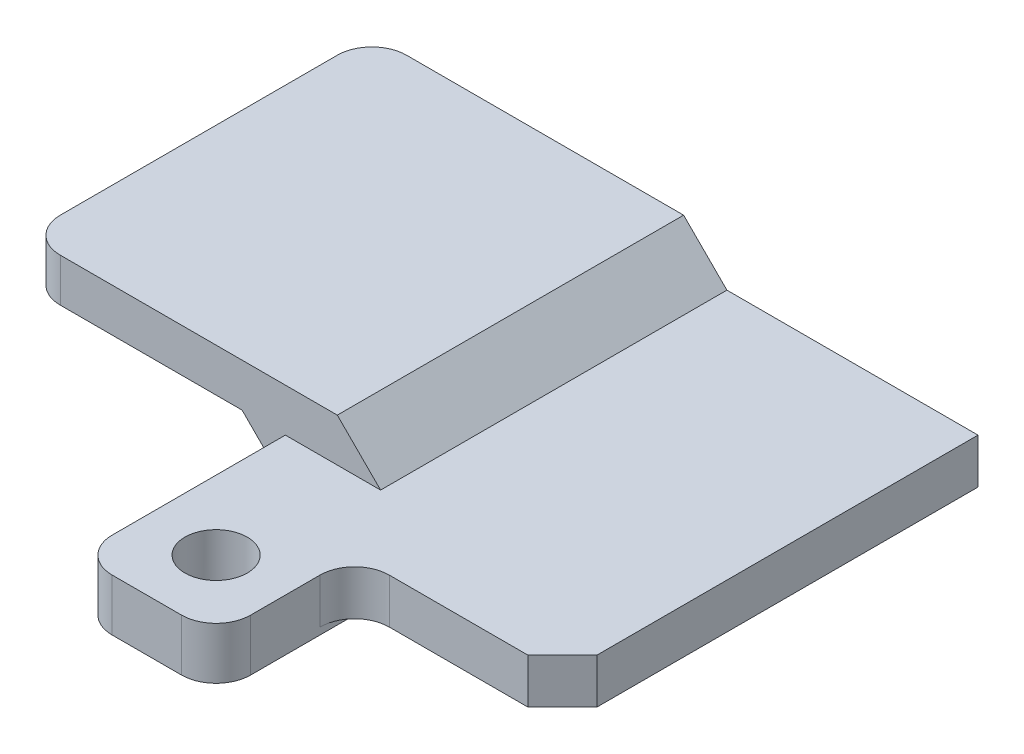
ISO-10303-21;
HEADER;
FILE_DESCRIPTION(('STEP AP214'),'2;1');
FILE_NAME('part.step','',(''),(''),'','','');
FILE_SCHEMA(('AUTOMOTIVE_DESIGN { 1 0 10303 214 1 1 1 1 }'));
ENDSEC;
DATA;
#1=APPLICATION_CONTEXT('core data for automotive mechanical design processes');
#2=APPLICATION_PROTOCOL_DEFINITION('international standard','automotive_design',2000,#1);
#3=PRODUCT_CONTEXT('',#1,'mechanical');
#4=PRODUCT('Part','Part','',(#3));
#5=PRODUCT_RELATED_PRODUCT_CATEGORY('part','',(#4));
#6=PRODUCT_DEFINITION_FORMATION('','',#4);
#7=PRODUCT_DEFINITION_CONTEXT('part definition',#1,'design');
#8=PRODUCT_DEFINITION('design','',#6,#7);
#9=PRODUCT_DEFINITION_SHAPE('','',#8);
#10=(LENGTH_UNIT() NAMED_UNIT(*) SI_UNIT(.MILLI.,.METRE.));
#11=(NAMED_UNIT(*) PLANE_ANGLE_UNIT() SI_UNIT($,.RADIAN.));
#12=(NAMED_UNIT(*) SI_UNIT($,.STERADIAN.) SOLID_ANGLE_UNIT());
#13=UNCERTAINTY_MEASURE_WITH_UNIT(LENGTH_MEASURE(1.E-05),#10,'distance_accuracy_value','');
#14=(GEOMETRIC_REPRESENTATION_CONTEXT(3) GLOBAL_UNCERTAINTY_ASSIGNED_CONTEXT((#13)) GLOBAL_UNIT_ASSIGNED_CONTEXT((#10,
#11,#12)) REPRESENTATION_CONTEXT('',''));
#15=CARTESIAN_POINT('',(0.,0.,0.));
#16=DIRECTION('',(0.,0.,1.));
#17=DIRECTION('',(1.,0.,0.));
#18=AXIS2_PLACEMENT_3D('',#15,#16,#17);
#19=CARTESIAN_POINT('',(0.,3.,0.));
#20=DIRECTION('',(0.,0.,-1.));
#21=DIRECTION('',(-1.,0.,0.));
#22=AXIS2_PLACEMENT_3D('',#19,#20,#21);
#23=PLANE('',#22);
#24=DIRECTION('',(-1.,0.,0.));
#25=VECTOR('',#24,1.);
#26=CARTESIAN_POINT('',(0.,0.4,0.));
#27=LINE('',#26,#25);
#28=CARTESIAN_POINT('',(18.,0.4,0.));
#29=VERTEX_POINT('',#28);
#30=CARTESIAN_POINT('',(10.,0.4,0.));
#31=VERTEX_POINT('',#30);
#32=EDGE_CURVE('E202',#29,#31,#27,.T.);
#33=ORIENTED_EDGE('',*,*,#32,.F.);
#34=DIRECTION('',(0.,1.,0.));
#35=VECTOR('',#34,1.);
#36=CARTESIAN_POINT('',(18.,3.,0.));
#37=LINE('',#36,#35);
#38=CARTESIAN_POINT('',(18.,3.,0.));
#39=VERTEX_POINT('',#38);
#40=EDGE_CURVE('E298',#29,#39,#37,.T.);
#41=ORIENTED_EDGE('',*,*,#40,.T.);
#42=DIRECTION('',(1.,0.,0.));
#43=VECTOR('',#42,1.);
#44=CARTESIAN_POINT('',(0.,3.,0.));
#45=LINE('',#44,#43);
#46=CARTESIAN_POINT('',(10.,3.,0.));
#47=VERTEX_POINT('',#46);
#48=EDGE_CURVE('E256',#47,#39,#45,.T.);
#49=ORIENTED_EDGE('',*,*,#48,.F.);
#50=DIRECTION('',(0.,1.,0.));
#51=VECTOR('',#50,1.);
#52=CARTESIAN_POINT('',(10.,3.,0.));
#53=LINE('',#52,#51);
#54=EDGE_CURVE('E273',#47,#31,#53,.F.);
#55=ORIENTED_EDGE('',*,*,#54,.T.);
#56=EDGE_LOOP('',(#33,#41,#49,#55));
#57=FACE_BOUND('',#56,.T.);
#58=ADVANCED_FACE('F35',(#57),#23,.F.);
#59=CARTESIAN_POINT('',(0.,3.,0.));
#60=DIRECTION('',(1.,0.,0.));
#61=DIRECTION('',(0.,0.,-1.));
#62=AXIS2_PLACEMENT_3D('',#59,#60,#61);
#63=PLANE('',#62);
#64=DIRECTION('',(0.,-1.,0.));
#65=VECTOR('',#64,1.);
#66=CARTESIAN_POINT('',(0.,0.4,0.));
#67=LINE('',#66,#65);
#68=CARTESIAN_POINT('',(0.,0.4,0.));
#69=VERTEX_POINT('',#68);
#70=CARTESIAN_POINT('',(0.,0.,0.));
#71=VERTEX_POINT('',#70);
#72=EDGE_CURVE('E171',#69,#71,#67,.T.);
#73=ORIENTED_EDGE('',*,*,#72,.T.);
#74=DIRECTION('',(0.,0.,1.));
#75=VECTOR('',#74,1.);
#76=CARTESIAN_POINT('',(0.,0.,0.));
#77=LINE('',#76,#75);
#78=CARTESIAN_POINT('',(0.,0.,6.));
#79=VERTEX_POINT('',#78);
#80=EDGE_CURVE('E250',#71,#79,#77,.T.);
#81=ORIENTED_EDGE('',*,*,#80,.T.);
#82=DIRECTION('',(0.,1.,0.));
#83=VECTOR('',#82,1.);
#84=CARTESIAN_POINT('',(0.,3.,6.));
#85=LINE('',#84,#83);
#86=CARTESIAN_POINT('',(0.,3.,6.));
#87=VERTEX_POINT('',#86);
#88=EDGE_CURVE('E290',#79,#87,#85,.T.);
#89=ORIENTED_EDGE('',*,*,#88,.T.);
#90=DIRECTION('',(0.,0.,1.));
#91=VECTOR('',#90,1.);
#92=CARTESIAN_POINT('',(0.,3.,0.));
#93=LINE('',#92,#91);
#94=CARTESIAN_POINT('',(0.,3.,-4.));
#95=VERTEX_POINT('',#94);
#96=EDGE_CURVE('E254',#95,#87,#93,.T.);
#97=ORIENTED_EDGE('',*,*,#96,.F.);
#98=DIRECTION('',(0.,1.,0.));
#99=VECTOR('',#98,1.);
#100=CARTESIAN_POINT('',(0.,0.499999999999984,-4.));
#101=LINE('',#100,#99);
#102=CARTESIAN_POINT('',(0.,0.499999999999984,-4.));
#103=VERTEX_POINT('',#102);
#104=EDGE_CURVE('E214',#103,#95,#101,.T.);
#105=ORIENTED_EDGE('',*,*,#104,.F.);
#106=DIRECTION('',(0.,0.,-1.));
#107=VECTOR('',#106,1.);
#108=CARTESIAN_POINT('',(0.,0.499999999999984,0.));
#109=LINE('',#108,#107);
#110=CARTESIAN_POINT('',(0.,0.499999999999984,-24.));
#111=VERTEX_POINT('',#110);
#112=EDGE_CURVE('E305',#103,#111,#109,.T.);
#113=ORIENTED_EDGE('',*,*,#112,.T.);
#114=DIRECTION('',(0.,-1.,0.));
#115=VECTOR('',#114,1.);
#116=CARTESIAN_POINT('',(0.,3.,-24.));
#117=LINE('',#116,#115);
#118=CARTESIAN_POINT('',(0.,0.4,-24.));
#119=VERTEX_POINT('',#118);
#120=EDGE_CURVE('E194',#111,#119,#117,.T.);
#121=ORIENTED_EDGE('',*,*,#120,.T.);
#122=DIRECTION('',(0.,0.,-1.));
#123=VECTOR('',#122,1.);
#124=CARTESIAN_POINT('',(0.,0.4,0.));
#125=LINE('',#124,#123);
#126=EDGE_CURVE('E187',#69,#119,#125,.T.);
#127=ORIENTED_EDGE('',*,*,#126,.F.);
#128=EDGE_LOOP('',(#73,#81,#89,#97,#105,#113,#121,#127));
#129=FACE_BOUND('',#128,.T.);
#130=ADVANCED_FACE('F192',(#129),#63,.F.);
#131=CARTESIAN_POINT('',(20.,3.,0.));
#132=DIRECTION('',(-1.,0.,0.));
#133=DIRECTION('',(0.,0.,1.));
#134=AXIS2_PLACEMENT_3D('',#131,#132,#133);
#135=PLANE('',#134);
#136=DIRECTION('',(0.,0.,1.));
#137=VECTOR('',#136,1.);
#138=CARTESIAN_POINT('',(20.,0.4,0.));
#139=LINE('',#138,#137);
#140=CARTESIAN_POINT('',(20.,0.4,-24.));
#141=VERTEX_POINT('',#140);
#142=CARTESIAN_POINT('',(20.,0.4,-2.));
#143=VERTEX_POINT('',#142);
#144=EDGE_CURVE('E50',#141,#143,#139,.T.);
#145=ORIENTED_EDGE('',*,*,#144,.F.);
#146=DIRECTION('',(0.,-1.,0.));
#147=VECTOR('',#146,1.);
#148=CARTESIAN_POINT('',(20.,3.,-24.));
#149=LINE('',#148,#147);
#150=CARTESIAN_POINT('',(20.,3.,-24.));
#151=VERTEX_POINT('',#150);
#152=EDGE_CURVE('E266',#151,#141,#149,.T.);
#153=ORIENTED_EDGE('',*,*,#152,.F.);
#154=DIRECTION('',(0.,0.,-1.));
#155=VECTOR('',#154,1.);
#156=CARTESIAN_POINT('',(20.,3.,0.));
#157=LINE('',#156,#155);
#158=CARTESIAN_POINT('',(20.,3.,-2.));
#159=VERTEX_POINT('',#158);
#160=EDGE_CURVE('E259',#159,#151,#157,.T.);
#161=ORIENTED_EDGE('',*,*,#160,.F.);
#162=DIRECTION('',(0.,-1.,0.));
#163=VECTOR('',#162,1.);
#164=CARTESIAN_POINT('',(20.,3.,-2.));
#165=LINE('',#164,#163);
#166=EDGE_CURVE('E295',#159,#143,#165,.T.);
#167=ORIENTED_EDGE('',*,*,#166,.T.);
#168=EDGE_LOOP('',(#145,#153,#161,#167));
#169=FACE_BOUND('',#168,.T.);
#170=ADVANCED_FACE('F370',(#169),#135,.F.);
#171=CARTESIAN_POINT('',(0.,3.,-24.));
#172=DIRECTION('',(0.,0.,1.));
#173=DIRECTION('',(1.,0.,0.));
#174=AXIS2_PLACEMENT_3D('',#171,#172,#173);
#175=PLANE('',#174);
#176=DIRECTION('',(1.,0.,0.));
#177=VECTOR('',#176,1.);
#178=CARTESIAN_POINT('',(0.,0.4,-24.));
#179=LINE('',#178,#177);
#180=EDGE_CURVE('E195',#119,#141,#179,.T.);
#181=ORIENTED_EDGE('',*,*,#180,.F.);
#182=ORIENTED_EDGE('',*,*,#120,.F.);
#183=DIRECTION('',(-0.707106781186544,0.707106781186551,0.));
#184=VECTOR('',#183,1.);
#185=CARTESIAN_POINT('',(-1.25000000000001,1.75000000000001,-24.));
#186=LINE('',#185,#184);
#187=CARTESIAN_POINT('',(-2.49999999999999,3.,-24.));
#188=VERTEX_POINT('',#187);
#189=EDGE_CURVE('E310',#111,#188,#186,.T.);
#190=ORIENTED_EDGE('',*,*,#189,.T.);
#191=DIRECTION('',(-1.,0.,0.));
#192=VECTOR('',#191,1.);
#193=CARTESIAN_POINT('',(3.,3.,-24.));
#194=LINE('',#193,#192);
#195=CARTESIAN_POINT('',(-13.,3.,-24.));
#196=VERTEX_POINT('',#195);
#197=EDGE_CURVE('E224',#188,#196,#194,.T.);
#198=ORIENTED_EDGE('',*,*,#197,.T.);
#199=DIRECTION('',(0.,-1.,0.));
#200=VECTOR('',#199,1.);
#201=CARTESIAN_POINT('',(-13.,3.,-24.));
#202=LINE('',#201,#200);
#203=CARTESIAN_POINT('',(-13.,5.5,-24.));
#204=VERTEX_POINT('',#203);
#205=EDGE_CURVE('E11',#196,#204,#202,.F.);
#206=ORIENTED_EDGE('',*,*,#205,.T.);
#207=DIRECTION('',(-1.,0.,0.));
#208=VECTOR('',#207,1.);
#209=CARTESIAN_POINT('',(3.,5.5,-24.));
#210=LINE('',#209,#208);
#211=CARTESIAN_POINT('',(3.,5.5,-24.));
#212=VERTEX_POINT('',#211);
#213=EDGE_CURVE('E227',#212,#204,#210,.T.);
#214=ORIENTED_EDGE('',*,*,#213,.F.);
#215=DIRECTION('',(-0.707106781186549,0.707106781186546,0.));
#216=VECTOR('',#215,1.);
#217=CARTESIAN_POINT('',(2.74999999999999,5.75,-24.));
#218=LINE('',#217,#216);
#219=CARTESIAN_POINT('',(5.50000000000001,3.,-24.));
#220=VERTEX_POINT('',#219);
#221=EDGE_CURVE('E312',#212,#220,#218,.F.);
#222=ORIENTED_EDGE('',*,*,#221,.T.);
#223=DIRECTION('',(-1.,0.,0.));
#224=VECTOR('',#223,1.);
#225=CARTESIAN_POINT('',(0.,3.,-24.));
#226=LINE('',#225,#224);
#227=EDGE_CURVE('E261',#151,#220,#226,.T.);
#228=ORIENTED_EDGE('',*,*,#227,.F.);
#229=ORIENTED_EDGE('',*,*,#152,.T.);
#230=EDGE_LOOP('',(#181,#182,#190,#198,#206,#214,#222,#228,#229));
#231=FACE_BOUND('',#230,.T.);
#232=ADVANCED_FACE('F351',(#231),#175,.F.);
#233=CARTESIAN_POINT('',(0.,0.,0.));
#234=DIRECTION('',(0.,-1.,0.));
#235=DIRECTION('',(0.,0.,-1.));
#236=AXIS2_PLACEMENT_3D('',#233,#234,#235);
#237=PLANE('',#236);
#238=CARTESIAN_POINT('',(4.,0.,4.));
#239=DIRECTION('',(0.,-1.,0.));
#240=DIRECTION('',(0.,0.,-1.));
#241=AXIS2_PLACEMENT_3D('',#238,#239,#240);
#242=CIRCLE('',#241,1.8);
#243=CARTESIAN_POINT('',(4.,0.,2.2));
#244=VERTEX_POINT('',#243);
#245=EDGE_CURVE('E240',#244,#244,#242,.F.);
#246=ORIENTED_EDGE('',*,*,#245,.T.);
#247=EDGE_LOOP('',(#246));
#248=FACE_BOUND('',#247,.T.);
#249=ORIENTED_EDGE('',*,*,#80,.F.);
#250=DIRECTION('',(1.,0.,0.));
#251=VECTOR('',#250,1.);
#252=CARTESIAN_POINT('',(0.,0.,0.));
#253=LINE('',#252,#251);
#254=CARTESIAN_POINT('',(8.,0.,0.));
#255=VERTEX_POINT('',#254);
#256=EDGE_CURVE('E178',#71,#255,#253,.T.);
#257=ORIENTED_EDGE('',*,*,#256,.T.);
#258=DIRECTION('',(0.,0.,-1.));
#259=VECTOR('',#258,1.);
#260=CARTESIAN_POINT('',(8.,0.,8.));
#261=LINE('',#260,#259);
#262=CARTESIAN_POINT('',(8.,0.,6.));
#263=VERTEX_POINT('',#262);
#264=EDGE_CURVE('E233',#263,#255,#261,.T.);
#265=ORIENTED_EDGE('',*,*,#264,.F.);
#266=CARTESIAN_POINT('',(6.,0.,6.));
#267=DIRECTION('',(0.,-1.,0.));
#268=DIRECTION('',(0.,0.,-1.));
#269=AXIS2_PLACEMENT_3D('',#266,#267,#268);
#270=CIRCLE('',#269,2.);
#271=CARTESIAN_POINT('',(6.,0.,8.));
#272=VERTEX_POINT('',#271);
#273=EDGE_CURVE('E288',#263,#272,#270,.T.);
#274=ORIENTED_EDGE('',*,*,#273,.T.);
#275=DIRECTION('',(1.,0.,0.));
#276=VECTOR('',#275,1.);
#277=CARTESIAN_POINT('',(0.,0.,8.));
#278=LINE('',#277,#276);
#279=CARTESIAN_POINT('',(2.,0.,8.));
#280=VERTEX_POINT('',#279);
#281=EDGE_CURVE('E247',#280,#272,#278,.T.);
#282=ORIENTED_EDGE('',*,*,#281,.F.);
#283=CARTESIAN_POINT('',(2.,0.,6.));
#284=DIRECTION('',(0.,-1.,0.));
#285=DIRECTION('',(0.,0.,-1.));
#286=AXIS2_PLACEMENT_3D('',#283,#284,#285);
#287=CIRCLE('',#286,2.);
#288=EDGE_CURVE('E285',#280,#79,#287,.T.);
#289=ORIENTED_EDGE('',*,*,#288,.T.);
#290=EDGE_LOOP('',(#249,#257,#265,#274,#282,#289));
#291=FACE_BOUND('',#290,.T.);
#292=ADVANCED_FACE('F390',(#248,#291),#237,.T.);
#293=CARTESIAN_POINT('',(10.,-11.3137084989848,2.));
#294=DIRECTION('',(0.,1.,0.));
#295=DIRECTION('',(0.,0.,1.));
#296=AXIS2_PLACEMENT_3D('',#293,#294,#295);
#297=CYLINDRICAL_SURFACE('',#296,2.);
#298=CARTESIAN_POINT('',(10.,0.4,2.));
#299=DIRECTION('',(0.,-1.,0.));
#300=DIRECTION('',(0.,0.,-1.));
#301=AXIS2_PLACEMENT_3D('',#298,#299,#300);
#302=CIRCLE('',#301,2.);
#303=CARTESIAN_POINT('',(8.,0.4,2.));
#304=VERTEX_POINT('',#303);
#305=EDGE_CURVE('E204',#31,#304,#302,.F.);
#306=ORIENTED_EDGE('',*,*,#305,.F.);
#307=ORIENTED_EDGE('',*,*,#54,.F.);
#308=CARTESIAN_POINT('',(10.,3.,2.));
#309=DIRECTION('',(0.,-1.,0.));
#310=DIRECTION('',(0.,0.,-1.));
#311=AXIS2_PLACEMENT_3D('',#308,#309,#310);
#312=CIRCLE('',#311,2.);
#313=CARTESIAN_POINT('',(8.,3.,2.));
#314=VERTEX_POINT('',#313);
#315=EDGE_CURVE('E293',#314,#47,#312,.T.);
#316=ORIENTED_EDGE('',*,*,#315,.F.);
#317=DIRECTION('',(0.,1.,0.));
#318=VECTOR('',#317,1.);
#319=CARTESIAN_POINT('',(8.,-11.3137084989848,2.));
#320=LINE('',#319,#318);
#321=EDGE_CURVE('E271',#304,#314,#320,.T.);
#322=ORIENTED_EDGE('',*,*,#321,.F.);
#323=EDGE_LOOP('',(#306,#307,#316,#322));
#324=FACE_BOUND('',#323,.T.);
#325=ADVANCED_FACE('F383',(#324),#297,.F.);
#326=CARTESIAN_POINT('',(20.,3.,-2.));
#327=DIRECTION('',(-0.707106781186547,0.,-0.707106781186548));
#328=DIRECTION('',(0.,-1.,0.));
#329=AXIS2_PLACEMENT_3D('',#326,#327,#328);
#330=PLANE('',#329);
#331=ORIENTED_EDGE('',*,*,#40,.F.);
#332=DIRECTION('',(-0.707106781186548,0.,0.707106781186547));
#333=VECTOR('',#332,1.);
#334=CARTESIAN_POINT('',(8.99999999999998,0.4,9.));
#335=LINE('',#334,#333);
#336=EDGE_CURVE('E200',#143,#29,#335,.T.);
#337=ORIENTED_EDGE('',*,*,#336,.F.);
#338=ORIENTED_EDGE('',*,*,#166,.F.);
#339=DIRECTION('',(-0.707106781186548,0.,0.707106781186547));
#340=VECTOR('',#339,1.);
#341=CARTESIAN_POINT('',(20.,3.,-2.));
#342=LINE('',#341,#340);
#343=EDGE_CURVE('E300',#39,#159,#342,.F.);
#344=ORIENTED_EDGE('',*,*,#343,.F.);
#345=EDGE_LOOP('',(#331,#337,#338,#344));
#346=FACE_BOUND('',#345,.T.);
#347=ADVANCED_FACE('F375',(#346),#330,.F.);
#348=CARTESIAN_POINT('',(-15.,5.5,-24.));
#349=DIRECTION('',(1.,0.,0.));
#350=DIRECTION('',(0.,0.,-1.));
#351=AXIS2_PLACEMENT_3D('',#348,#349,#350);
#352=PLANE('',#351);
#353=DIRECTION('',(0.,0.,1.));
#354=VECTOR('',#353,1.);
#355=CARTESIAN_POINT('',(-15.,3.,-24.));
#356=LINE('',#355,#354);
#357=CARTESIAN_POINT('',(-15.,3.,-22.));
#358=VERTEX_POINT('',#357);
#359=CARTESIAN_POINT('',(-15.,3.,-6.));
#360=VERTEX_POINT('',#359);
#361=EDGE_CURVE('E228',#358,#360,#356,.T.);
#362=ORIENTED_EDGE('',*,*,#361,.T.);
#363=DIRECTION('',(0.,-1.,0.));
#364=VECTOR('',#363,1.);
#365=CARTESIAN_POINT('',(-15.,5.5,-6.));
#366=LINE('',#365,#364);
#367=CARTESIAN_POINT('',(-15.,5.5,-6.));
#368=VERTEX_POINT('',#367);
#369=EDGE_CURVE('E324',#360,#368,#366,.F.);
#370=ORIENTED_EDGE('',*,*,#369,.T.);
#371=DIRECTION('',(0.,0.,1.));
#372=VECTOR('',#371,1.);
#373=CARTESIAN_POINT('',(-15.,5.5,-24.));
#374=LINE('',#373,#372);
#375=CARTESIAN_POINT('',(-15.,5.5,-22.));
#376=VERTEX_POINT('',#375);
#377=EDGE_CURVE('E230',#376,#368,#374,.T.);
#378=ORIENTED_EDGE('',*,*,#377,.F.);
#379=DIRECTION('',(0.,-1.,0.));
#380=VECTOR('',#379,1.);
#381=CARTESIAN_POINT('',(-15.,5.5,-22.));
#382=LINE('',#381,#380);
#383=EDGE_CURVE('E321',#376,#358,#382,.T.);
#384=ORIENTED_EDGE('',*,*,#383,.T.);
#385=EDGE_LOOP('',(#362,#370,#378,#384));
#386=FACE_BOUND('',#385,.T.);
#387=ADVANCED_FACE('F345',(#386),#352,.F.);
#388=CARTESIAN_POINT('',(0.,5.5,0.));
#389=DIRECTION('',(0.,-1.,0.));
#390=DIRECTION('',(0.,0.,-1.));
#391=AXIS2_PLACEMENT_3D('',#388,#389,#390);
#392=PLANE('',#391);
#393=ORIENTED_EDGE('',*,*,#377,.T.);
#394=CARTESIAN_POINT('',(-13.,5.5,-6.));
#395=DIRECTION('',(0.,-1.,0.));
#396=DIRECTION('',(0.,0.,-1.));
#397=AXIS2_PLACEMENT_3D('',#394,#395,#396);
#398=CIRCLE('',#397,2.);
#399=CARTESIAN_POINT('',(-13.,5.5,-4.));
#400=VERTEX_POINT('',#399);
#401=EDGE_CURVE('E43',#368,#400,#398,.F.);
#402=ORIENTED_EDGE('',*,*,#401,.T.);
#403=DIRECTION('',(-1.,0.,0.));
#404=VECTOR('',#403,1.);
#405=CARTESIAN_POINT('',(3.,5.5,-4.));
#406=LINE('',#405,#404);
#407=CARTESIAN_POINT('',(3.,5.5,-4.));
#408=VERTEX_POINT('',#407);
#409=EDGE_CURVE('E221',#408,#400,#406,.T.);
#410=ORIENTED_EDGE('',*,*,#409,.F.);
#411=DIRECTION('',(0.,0.,-1.));
#412=VECTOR('',#411,1.);
#413=CARTESIAN_POINT('',(3.,5.5,-24.));
#414=LINE('',#413,#412);
#415=EDGE_CURVE('E225',#408,#212,#414,.T.);
#416=ORIENTED_EDGE('',*,*,#415,.T.);
#417=ORIENTED_EDGE('',*,*,#213,.T.);
#418=CARTESIAN_POINT('',(-13.,5.5,-22.));
#419=DIRECTION('',(0.,-1.,0.));
#420=DIRECTION('',(0.,0.,-1.));
#421=AXIS2_PLACEMENT_3D('',#418,#419,#420);
#422=CIRCLE('',#421,2.);
#423=EDGE_CURVE('E326',#204,#376,#422,.F.);
#424=ORIENTED_EDGE('',*,*,#423,.T.);
#425=EDGE_LOOP('',(#393,#402,#410,#416,#417,#424));
#426=FACE_BOUND('',#425,.T.);
#427=ADVANCED_FACE('F330',(#426),#392,.F.);
#428=CARTESIAN_POINT('',(0.,3.,0.));
#429=DIRECTION('',(0.,-1.,0.));
#430=DIRECTION('',(0.,0.,-1.));
#431=AXIS2_PLACEMENT_3D('',#428,#429,#430);
#432=PLANE('',#431);
#433=DIRECTION('',(1.,0.,0.));
#434=VECTOR('',#433,1.);
#435=CARTESIAN_POINT('',(-15.,3.,-4.));
#436=LINE('',#435,#434);
#437=CARTESIAN_POINT('',(-13.,3.,-4.));
#438=VERTEX_POINT('',#437);
#439=CARTESIAN_POINT('',(-2.49999999999999,3.,-4.));
#440=VERTEX_POINT('',#439);
#441=EDGE_CURVE('E208',#438,#440,#436,.T.);
#442=ORIENTED_EDGE('',*,*,#441,.F.);
#443=CARTESIAN_POINT('',(-13.,3.,-6.));
#444=DIRECTION('',(0.,-1.,0.));
#445=DIRECTION('',(0.,0.,-1.));
#446=AXIS2_PLACEMENT_3D('',#443,#444,#445);
#447=CIRCLE('',#446,2.);
#448=EDGE_CURVE('E319',#438,#360,#447,.T.);
#449=ORIENTED_EDGE('',*,*,#448,.T.);
#450=ORIENTED_EDGE('',*,*,#361,.F.);
#451=CARTESIAN_POINT('',(-13.,3.,-22.));
#452=DIRECTION('',(0.,-1.,0.));
#453=DIRECTION('',(0.,0.,-1.));
#454=AXIS2_PLACEMENT_3D('',#451,#452,#453);
#455=CIRCLE('',#454,2.);
#456=EDGE_CURVE('E317',#358,#196,#455,.T.);
#457=ORIENTED_EDGE('',*,*,#456,.T.);
#458=ORIENTED_EDGE('',*,*,#197,.F.);
#459=DIRECTION('',(0.,0.,1.));
#460=VECTOR('',#459,1.);
#461=CARTESIAN_POINT('',(-2.49999999999999,3.,0.));
#462=LINE('',#461,#460);
#463=EDGE_CURVE('E302',#188,#440,#462,.T.);
#464=ORIENTED_EDGE('',*,*,#463,.T.);
#465=EDGE_LOOP('',(#442,#449,#450,#457,#458,#464));
#466=FACE_BOUND('',#465,.T.);
#467=ADVANCED_FACE('F343',(#466),#432,.T.);
#468=CARTESIAN_POINT('',(-2.49999999999999,3.,0.));
#469=DIRECTION('',(0.707106781186551,0.707106781186544,0.));
#470=DIRECTION('',(0.,0.,1.));
#471=AXIS2_PLACEMENT_3D('',#468,#469,#470);
#472=PLANE('',#471);
#473=DIRECTION('',(0.707106781186544,-0.707106781186551,0.));
#474=VECTOR('',#473,1.);
#475=CARTESIAN_POINT('',(-2.49999999999999,3.,-4.));
#476=LINE('',#475,#474);
#477=EDGE_CURVE('E211',#440,#103,#476,.T.);
#478=ORIENTED_EDGE('',*,*,#477,.F.);
#479=ORIENTED_EDGE('',*,*,#463,.F.);
#480=ORIENTED_EDGE('',*,*,#189,.F.);
#481=ORIENTED_EDGE('',*,*,#112,.F.);
#482=EDGE_LOOP('',(#478,#479,#480,#481));
#483=FACE_BOUND('',#482,.T.);
#484=ADVANCED_FACE('F356',(#483),#472,.F.);
#485=CARTESIAN_POINT('',(3.,5.5,-24.));
#486=DIRECTION('',(0.707106781186546,0.707106781186549,0.));
#487=DIRECTION('',(0.,0.,1.));
#488=AXIS2_PLACEMENT_3D('',#485,#486,#487);
#489=PLANE('',#488);
#490=DIRECTION('',(-0.707106781186549,0.707106781186546,0.));
#491=VECTOR('',#490,1.);
#492=CARTESIAN_POINT('',(5.50000000000001,3.,-4.));
#493=LINE('',#492,#491);
#494=CARTESIAN_POINT('',(5.50000000000001,3.,-4.));
#495=VERTEX_POINT('',#494);
#496=EDGE_CURVE('E219',#495,#408,#493,.T.);
#497=ORIENTED_EDGE('',*,*,#496,.F.);
#498=DIRECTION('',(0.,0.,1.));
#499=VECTOR('',#498,1.);
#500=CARTESIAN_POINT('',(5.50000000000001,3.,0.));
#501=LINE('',#500,#499);
#502=EDGE_CURVE('E307',#220,#495,#501,.T.);
#503=ORIENTED_EDGE('',*,*,#502,.F.);
#504=ORIENTED_EDGE('',*,*,#221,.F.);
#505=ORIENTED_EDGE('',*,*,#415,.F.);
#506=EDGE_LOOP('',(#497,#503,#504,#505));
#507=FACE_BOUND('',#506,.T.);
#508=ADVANCED_FACE('F366',(#507),#489,.T.);
#509=CARTESIAN_POINT('',(0.,3.,0.));
#510=DIRECTION('',(0.,-1.,0.));
#511=DIRECTION('',(0.,0.,-1.));
#512=AXIS2_PLACEMENT_3D('',#509,#510,#511);
#513=PLANE('',#512);
#514=CARTESIAN_POINT('',(4.,3.,4.));
#515=DIRECTION('',(0.,1.,0.));
#516=DIRECTION('',(0.,0.,1.));
#517=AXIS2_PLACEMENT_3D('',#514,#515,#516);
#518=CIRCLE('',#517,1.8);
#519=CARTESIAN_POINT('',(4.,3.,5.8));
#520=VERTEX_POINT('',#519);
#521=EDGE_CURVE('E244',#520,#520,#518,.T.);
#522=ORIENTED_EDGE('',*,*,#521,.F.);
#523=EDGE_LOOP('',(#522));
#524=FACE_BOUND('',#523,.T.);
#525=ORIENTED_EDGE('',*,*,#227,.T.);
#526=ORIENTED_EDGE('',*,*,#502,.T.);
#527=DIRECTION('',(1.,0.,0.));
#528=VECTOR('',#527,1.);
#529=CARTESIAN_POINT('',(0.,3.,-4.));
#530=LINE('',#529,#528);
#531=EDGE_CURVE('E217',#95,#495,#530,.T.);
#532=ORIENTED_EDGE('',*,*,#531,.F.);
#533=ORIENTED_EDGE('',*,*,#96,.T.);
#534=CARTESIAN_POINT('',(2.,3.,6.));
#535=DIRECTION('',(0.,-1.,0.));
#536=DIRECTION('',(0.,0.,-1.));
#537=AXIS2_PLACEMENT_3D('',#534,#535,#536);
#538=CIRCLE('',#537,2.);
#539=CARTESIAN_POINT('',(2.,3.,8.));
#540=VERTEX_POINT('',#539);
#541=EDGE_CURVE('E281',#87,#540,#538,.F.);
#542=ORIENTED_EDGE('',*,*,#541,.T.);
#543=DIRECTION('',(1.,0.,0.));
#544=VECTOR('',#543,1.);
#545=CARTESIAN_POINT('',(0.,3.,8.));
#546=LINE('',#545,#544);
#547=CARTESIAN_POINT('',(6.,3.,8.));
#548=VERTEX_POINT('',#547);
#549=EDGE_CURVE('E237',#540,#548,#546,.T.);
#550=ORIENTED_EDGE('',*,*,#549,.T.);
#551=CARTESIAN_POINT('',(6.,3.,6.));
#552=DIRECTION('',(0.,-1.,0.));
#553=DIRECTION('',(0.,0.,-1.));
#554=AXIS2_PLACEMENT_3D('',#551,#552,#553);
#555=CIRCLE('',#554,2.);
#556=CARTESIAN_POINT('',(8.,3.,6.));
#557=VERTEX_POINT('',#556);
#558=EDGE_CURVE('E283',#548,#557,#555,.F.);
#559=ORIENTED_EDGE('',*,*,#558,.T.);
#560=DIRECTION('',(0.,0.,-1.));
#561=VECTOR('',#560,1.);
#562=CARTESIAN_POINT('',(8.,3.,8.));
#563=LINE('',#562,#561);
#564=EDGE_CURVE('E241',#557,#314,#563,.T.);
#565=ORIENTED_EDGE('',*,*,#564,.T.);
#566=ORIENTED_EDGE('',*,*,#315,.T.);
#567=ORIENTED_EDGE('',*,*,#48,.T.);
#568=ORIENTED_EDGE('',*,*,#343,.T.);
#569=ORIENTED_EDGE('',*,*,#160,.T.);
#570=EDGE_LOOP('',(#525,#526,#532,#533,#542,#550,#559,#565,#566,#567,#568,#569));
#571=FACE_BOUND('',#570,.T.);
#572=ADVANCED_FACE('F361',(#524,#571),#513,.F.);
#573=CARTESIAN_POINT('',(8.,-11.3137084989848,8.));
#574=DIRECTION('',(1.,0.,0.));
#575=DIRECTION('',(0.,0.,-1.));
#576=AXIS2_PLACEMENT_3D('',#573,#574,#575);
#577=PLANE('',#576);
#578=ORIENTED_EDGE('',*,*,#264,.T.);
#579=DIRECTION('',(0.,-1.,0.));
#580=VECTOR('',#579,1.);
#581=CARTESIAN_POINT('',(8.,0.4,0.));
#582=LINE('',#581,#580);
#583=CARTESIAN_POINT('',(8.,0.4,0.));
#584=VERTEX_POINT('',#583);
#585=EDGE_CURVE('E182',#584,#255,#582,.T.);
#586=ORIENTED_EDGE('',*,*,#585,.F.);
#587=DIRECTION('',(0.,0.,-1.));
#588=VECTOR('',#587,1.);
#589=CARTESIAN_POINT('',(8.,0.4,0.));
#590=LINE('',#589,#588);
#591=EDGE_CURVE('E183',#304,#584,#590,.T.);
#592=ORIENTED_EDGE('',*,*,#591,.F.);
#593=ORIENTED_EDGE('',*,*,#321,.T.);
#594=ORIENTED_EDGE('',*,*,#564,.F.);
#595=DIRECTION('',(0.,1.,0.));
#596=VECTOR('',#595,1.);
#597=CARTESIAN_POINT('',(8.,-11.3137084989848,6.));
#598=LINE('',#597,#596);
#599=EDGE_CURVE('E269',#557,#263,#598,.F.);
#600=ORIENTED_EDGE('',*,*,#599,.T.);
#601=EDGE_LOOP('',(#578,#586,#592,#593,#594,#600));
#602=FACE_BOUND('',#601,.T.);
#603=ADVANCED_FACE('F386',(#602),#577,.T.);
#604=CARTESIAN_POINT('',(0.,-11.3137084989848,8.));
#605=DIRECTION('',(0.,0.,1.));
#606=DIRECTION('',(1.,0.,0.));
#607=AXIS2_PLACEMENT_3D('',#604,#605,#606);
#608=PLANE('',#607);
#609=ORIENTED_EDGE('',*,*,#281,.T.);
#610=DIRECTION('',(0.,1.,0.));
#611=VECTOR('',#610,1.);
#612=CARTESIAN_POINT('',(6.,-11.3137084989848,8.));
#613=LINE('',#612,#611);
#614=EDGE_CURVE('E278',#272,#548,#613,.T.);
#615=ORIENTED_EDGE('',*,*,#614,.T.);
#616=ORIENTED_EDGE('',*,*,#549,.F.);
#617=DIRECTION('',(0.,1.,0.));
#618=VECTOR('',#617,1.);
#619=CARTESIAN_POINT('',(2.,0.,8.));
#620=LINE('',#619,#618);
#621=EDGE_CURVE('E276',#540,#280,#620,.F.);
#622=ORIENTED_EDGE('',*,*,#621,.T.);
#623=EDGE_LOOP('',(#609,#615,#616,#622));
#624=FACE_BOUND('',#623,.T.);
#625=ADVANCED_FACE('F399',(#624),#608,.T.);
#626=CARTESIAN_POINT('',(4.,-11.3137084989848,4.));
#627=DIRECTION('',(0.,1.,0.));
#628=DIRECTION('',(0.,0.,1.));
#629=AXIS2_PLACEMENT_3D('',#626,#627,#628);
#630=CYLINDRICAL_SURFACE('',#629,1.8);
#631=ORIENTED_EDGE('',*,*,#521,.T.);
#632=EDGE_LOOP('',(#631));
#633=FACE_BOUND('',#632,.T.);
#634=ORIENTED_EDGE('',*,*,#245,.F.);
#635=EDGE_LOOP('',(#634));
#636=FACE_BOUND('',#635,.T.);
#637=ADVANCED_FACE('F405',(#633,#636),#630,.F.);
#638=CARTESIAN_POINT('',(6.,-11.3137084989848,6.));
#639=DIRECTION('',(0.,1.,0.));
#640=DIRECTION('',(0.,0.,1.));
#641=AXIS2_PLACEMENT_3D('',#638,#639,#640);
#642=CYLINDRICAL_SURFACE('',#641,2.);
#643=ORIENTED_EDGE('',*,*,#273,.F.);
#644=ORIENTED_EDGE('',*,*,#599,.F.);
#645=ORIENTED_EDGE('',*,*,#558,.F.);
#646=ORIENTED_EDGE('',*,*,#614,.F.);
#647=EDGE_LOOP('',(#643,#644,#645,#646));
#648=FACE_BOUND('',#647,.T.);
#649=ADVANCED_FACE('F402',(#648),#642,.T.);
#650=CARTESIAN_POINT('',(2.,3.,6.));
#651=DIRECTION('',(0.,-1.,0.));
#652=DIRECTION('',(0.,0.,-1.));
#653=AXIS2_PLACEMENT_3D('',#650,#651,#652);
#654=CYLINDRICAL_SURFACE('',#653,2.);
#655=ORIENTED_EDGE('',*,*,#288,.F.);
#656=ORIENTED_EDGE('',*,*,#621,.F.);
#657=ORIENTED_EDGE('',*,*,#541,.F.);
#658=ORIENTED_EDGE('',*,*,#88,.F.);
#659=EDGE_LOOP('',(#655,#656,#657,#658));
#660=FACE_BOUND('',#659,.T.);
#661=ADVANCED_FACE('F396',(#660),#654,.T.);
#662=CARTESIAN_POINT('',(0.,0.,-4.));
#663=DIRECTION('',(0.,0.,1.));
#664=DIRECTION('',(1.,0.,0.));
#665=AXIS2_PLACEMENT_3D('',#662,#663,#664);
#666=PLANE('',#665);
#667=ORIENTED_EDGE('',*,*,#409,.T.);
#668=DIRECTION('',(0.,-1.,0.));
#669=VECTOR('',#668,1.);
#670=CARTESIAN_POINT('',(-13.,3.,-4.));
#671=LINE('',#670,#669);
#672=EDGE_CURVE('E314',#400,#438,#671,.T.);
#673=ORIENTED_EDGE('',*,*,#672,.T.);
#674=ORIENTED_EDGE('',*,*,#441,.T.);
#675=ORIENTED_EDGE('',*,*,#477,.T.);
#676=ORIENTED_EDGE('',*,*,#104,.T.);
#677=ORIENTED_EDGE('',*,*,#531,.T.);
#678=ORIENTED_EDGE('',*,*,#496,.T.);
#679=EDGE_LOOP('',(#667,#673,#674,#675,#676,#677,#678));
#680=FACE_BOUND('',#679,.T.);
#681=ADVANCED_FACE('F337',(#680),#666,.T.);
#682=CARTESIAN_POINT('',(-13.,0.,-6.));
#683=DIRECTION('',(0.,1.,0.));
#684=DIRECTION('',(0.,0.,1.));
#685=AXIS2_PLACEMENT_3D('',#682,#683,#684);
#686=CYLINDRICAL_SURFACE('',#685,2.);
#687=ORIENTED_EDGE('',*,*,#401,.F.);
#688=ORIENTED_EDGE('',*,*,#369,.F.);
#689=ORIENTED_EDGE('',*,*,#448,.F.);
#690=ORIENTED_EDGE('',*,*,#672,.F.);
#691=EDGE_LOOP('',(#687,#688,#689,#690));
#692=FACE_BOUND('',#691,.T.);
#693=ADVANCED_FACE('F340',(#692),#686,.T.);
#694=CARTESIAN_POINT('',(-13.,5.5,-22.));
#695=DIRECTION('',(0.,-1.,0.));
#696=DIRECTION('',(0.,0.,-1.));
#697=AXIS2_PLACEMENT_3D('',#694,#695,#696);
#698=CYLINDRICAL_SURFACE('',#697,2.);
#699=ORIENTED_EDGE('',*,*,#423,.F.);
#700=ORIENTED_EDGE('',*,*,#205,.F.);
#701=ORIENTED_EDGE('',*,*,#456,.F.);
#702=ORIENTED_EDGE('',*,*,#383,.F.);
#703=EDGE_LOOP('',(#699,#700,#701,#702));
#704=FACE_BOUND('',#703,.T.);
#705=ADVANCED_FACE('F37',(#704),#698,.T.);
#706=CARTESIAN_POINT('',(0.,0.4,0.));
#707=DIRECTION('',(0.,0.,-1.));
#708=DIRECTION('',(-1.,0.,0.));
#709=AXIS2_PLACEMENT_3D('',#706,#707,#708);
#710=PLANE('',#709);
#711=ORIENTED_EDGE('',*,*,#256,.F.);
#712=ORIENTED_EDGE('',*,*,#72,.F.);
#713=DIRECTION('',(1.,0.,0.));
#714=VECTOR('',#713,1.);
#715=CARTESIAN_POINT('',(0.,0.4,0.));
#716=LINE('',#715,#714);
#717=EDGE_CURVE('E175',#69,#584,#716,.T.);
#718=ORIENTED_EDGE('',*,*,#717,.T.);
#719=ORIENTED_EDGE('',*,*,#585,.T.);
#720=EDGE_LOOP('',(#711,#712,#718,#719));
#721=FACE_BOUND('',#720,.T.);
#722=ADVANCED_FACE('F173',(#721),#710,.T.);
#723=CARTESIAN_POINT('',(0.,0.4,0.));
#724=DIRECTION('',(0.,-1.,0.));
#725=DIRECTION('',(0.,0.,-1.));
#726=AXIS2_PLACEMENT_3D('',#723,#724,#725);
#727=PLANE('',#726);
#728=ORIENTED_EDGE('',*,*,#717,.F.);
#729=ORIENTED_EDGE('',*,*,#126,.T.);
#730=ORIENTED_EDGE('',*,*,#180,.T.);
#731=ORIENTED_EDGE('',*,*,#144,.T.);
#732=ORIENTED_EDGE('',*,*,#336,.T.);
#733=ORIENTED_EDGE('',*,*,#32,.T.);
#734=ORIENTED_EDGE('',*,*,#305,.T.);
#735=ORIENTED_EDGE('',*,*,#591,.T.);
#736=EDGE_LOOP('',(#728,#729,#730,#731,#732,#733,#734,#735));
#737=FACE_BOUND('',#736,.T.);
#738=ADVANCED_FACE('F186',(#737),#727,.T.);
#739=CLOSED_SHELL('',(#58,#130,#170,#232,#292,#325,#347,#387,#427,#467,#484,#508,#572,#603,#625,
#637,#649,#661,#681,#693,#705,#722,#738));
#740=MANIFOLD_SOLID_BREP('B2',#739);
#741=ADVANCED_BREP_SHAPE_REPRESENTATION('',(#18,#740),#14);
#742=SHAPE_DEFINITION_REPRESENTATION(#9,#741);
ENDSEC;
END-ISO-10303-21;
